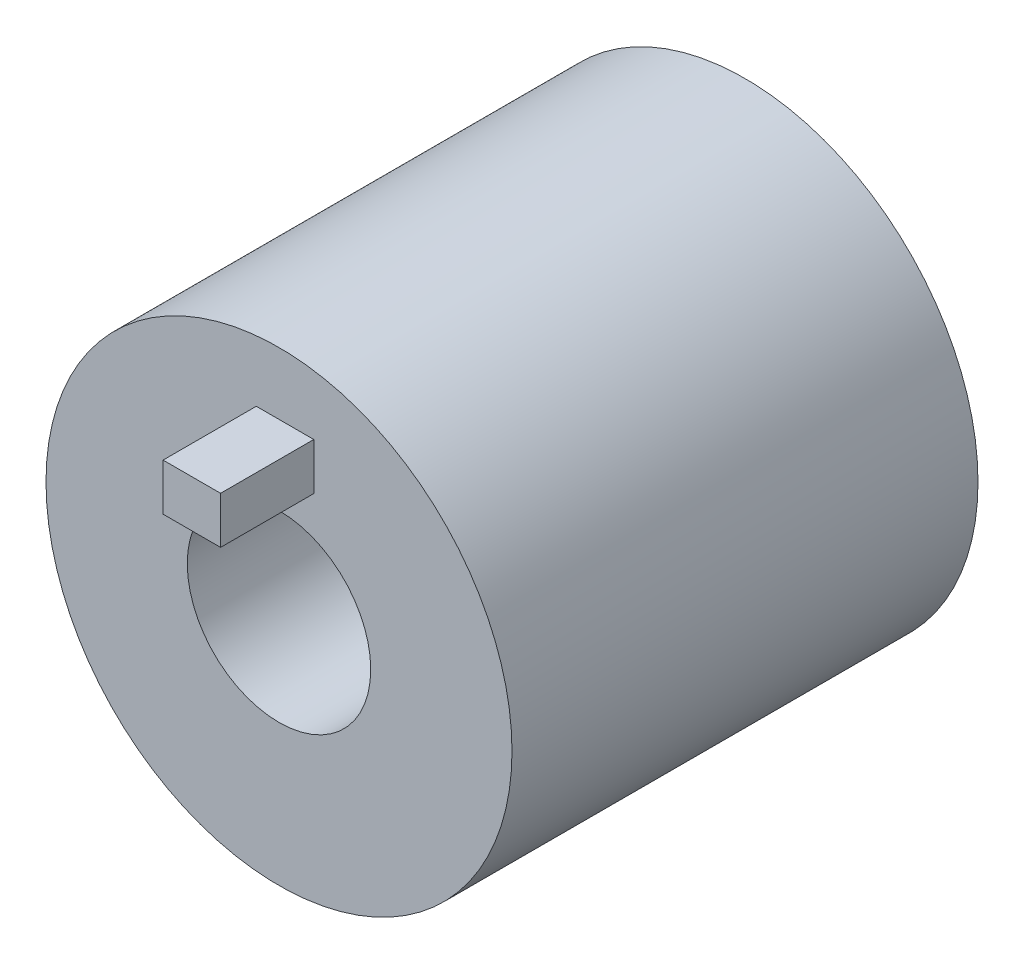
ISO-10303-21;
HEADER;
FILE_DESCRIPTION(('STEP AP214'),'2;1');
FILE_NAME('part.step','',(''),(''),'','','');
FILE_SCHEMA(('AUTOMOTIVE_DESIGN { 1 0 10303 214 1 1 1 1 }'));
ENDSEC;
DATA;
#1=APPLICATION_CONTEXT('core data for automotive mechanical design processes');
#2=APPLICATION_PROTOCOL_DEFINITION('international standard','automotive_design',2000,#1);
#3=PRODUCT_CONTEXT('',#1,'mechanical');
#4=PRODUCT('Part','Part','',(#3));
#5=PRODUCT_RELATED_PRODUCT_CATEGORY('part','',(#4));
#6=PRODUCT_DEFINITION_FORMATION('','',#4);
#7=PRODUCT_DEFINITION_CONTEXT('part definition',#1,'design');
#8=PRODUCT_DEFINITION('design','',#6,#7);
#9=PRODUCT_DEFINITION_SHAPE('','',#8);
#10=(LENGTH_UNIT() NAMED_UNIT(*) SI_UNIT(.MILLI.,.METRE.));
#11=(NAMED_UNIT(*) PLANE_ANGLE_UNIT() SI_UNIT($,.RADIAN.));
#12=(NAMED_UNIT(*) SI_UNIT($,.STERADIAN.) SOLID_ANGLE_UNIT());
#13=UNCERTAINTY_MEASURE_WITH_UNIT(LENGTH_MEASURE(1.E-05),#10,'distance_accuracy_value','');
#14=(GEOMETRIC_REPRESENTATION_CONTEXT(3) GLOBAL_UNCERTAINTY_ASSIGNED_CONTEXT((#13)) GLOBAL_UNIT_ASSIGNED_CONTEXT((#10,
#11,#12)) REPRESENTATION_CONTEXT('',''));
#15=CARTESIAN_POINT('',(0.,0.,0.));
#16=DIRECTION('',(0.,0.,1.));
#17=DIRECTION('',(1.,0.,0.));
#18=AXIS2_PLACEMENT_3D('',#15,#16,#17);
#19=CARTESIAN_POINT('',(0.,0.,12.7));
#20=DIRECTION('',(0.,0.,1.));
#21=DIRECTION('',(1.,0.,0.));
#22=AXIS2_PLACEMENT_3D('',#19,#20,#21);
#23=PLANE('',#22);
#24=CARTESIAN_POINT('',(0.,0.,12.7));
#25=DIRECTION('',(0.,0.,1.));
#26=DIRECTION('',(1.,0.,0.));
#27=AXIS2_PLACEMENT_3D('',#24,#25,#26);
#28=CIRCLE('',#27,6.35);
#29=CARTESIAN_POINT('',(6.35,0.,12.7));
#30=VERTEX_POINT('',#29);
#31=EDGE_CURVE('E11',#30,#30,#28,.T.);
#32=ORIENTED_EDGE('',*,*,#31,.T.);
#33=EDGE_LOOP('',(#32));
#34=FACE_BOUND('',#33,.T.);
#35=CARTESIAN_POINT('',(0.,0.,12.7));
#36=DIRECTION('',(0.,0.,1.));
#37=DIRECTION('',(1.,0.,0.));
#38=AXIS2_PLACEMENT_3D('',#35,#36,#37);
#39=CIRCLE('',#38,2.499995);
#40=CARTESIAN_POINT('',(2.499995,0.,12.7));
#41=VERTEX_POINT('',#40);
#42=EDGE_CURVE('E137',#41,#41,#39,.T.);
#43=ORIENTED_EDGE('',*,*,#42,.F.);
#44=EDGE_LOOP('',(#43));
#45=FACE_BOUND('',#44,.T.);
#46=DIRECTION('',(1.,0.,0.));
#47=VECTOR('',#46,1.);
#48=CARTESIAN_POINT('',(-0.61908162196643,3.37592946978573,12.7));
#49=LINE('',#48,#47);
#50=CARTESIAN_POINT('',(-0.61908162196643,3.37592946978573,12.7));
#51=VERTEX_POINT('',#50);
#52=CARTESIAN_POINT('',(0.947968733636093,3.37592946978573,12.7));
#53=VERTEX_POINT('',#52);
#54=EDGE_CURVE('E105',#51,#53,#49,.T.);
#55=ORIENTED_EDGE('',*,*,#54,.F.);
#56=DIRECTION('',(0.,-1.,0.));
#57=VECTOR('',#56,1.);
#58=CARTESIAN_POINT('',(-0.61908162196643,4.65278531509149,12.7));
#59=LINE('',#58,#57);
#60=CARTESIAN_POINT('',(-0.61908162196643,4.65278531509149,12.7));
#61=VERTEX_POINT('',#60);
#62=EDGE_CURVE('E119',#61,#51,#59,.T.);
#63=ORIENTED_EDGE('',*,*,#62,.F.);
#64=DIRECTION('',(-1.,0.,0.));
#65=VECTOR('',#64,1.);
#66=CARTESIAN_POINT('',(-0.61908162196643,4.65278531509149,12.7));
#67=LINE('',#66,#65);
#68=CARTESIAN_POINT('',(0.947968733636093,4.65278531509149,12.7));
#69=VERTEX_POINT('',#68);
#70=EDGE_CURVE('E85',#69,#61,#67,.T.);
#71=ORIENTED_EDGE('',*,*,#70,.F.);
#72=DIRECTION('',(0.,1.,0.));
#73=VECTOR('',#72,1.);
#74=CARTESIAN_POINT('',(0.947968733636093,4.65278531509149,12.7));
#75=LINE('',#74,#73);
#76=EDGE_CURVE('E125',#53,#69,#75,.T.);
#77=ORIENTED_EDGE('',*,*,#76,.F.);
#78=EDGE_LOOP('',(#55,#63,#71,#77));
#79=FACE_BOUND('',#78,.T.);
#80=ADVANCED_FACE('F47',(#34,#45,#79),#23,.T.);
#81=CARTESIAN_POINT('',(0.,0.,0.));
#82=DIRECTION('',(0.,0.,1.));
#83=DIRECTION('',(1.,0.,0.));
#84=AXIS2_PLACEMENT_3D('',#81,#82,#83);
#85=PLANE('',#84);
#86=CARTESIAN_POINT('',(0.,0.,0.));
#87=DIRECTION('',(0.,0.,1.));
#88=DIRECTION('',(1.,0.,0.));
#89=AXIS2_PLACEMENT_3D('',#86,#87,#88);
#90=CIRCLE('',#89,6.35);
#91=CARTESIAN_POINT('',(6.35,0.,0.));
#92=VERTEX_POINT('',#91);
#93=EDGE_CURVE('E51',#92,#92,#90,.T.);
#94=ORIENTED_EDGE('',*,*,#93,.F.);
#95=EDGE_LOOP('',(#94));
#96=FACE_BOUND('',#95,.T.);
#97=CARTESIAN_POINT('',(0.,0.,0.));
#98=DIRECTION('',(0.,0.,1.));
#99=DIRECTION('',(1.,0.,0.));
#100=AXIS2_PLACEMENT_3D('',#97,#98,#99);
#101=CIRCLE('',#100,2.499995);
#102=CARTESIAN_POINT('',(2.499995,0.,0.));
#103=VERTEX_POINT('',#102);
#104=EDGE_CURVE('E136',#103,#103,#101,.T.);
#105=ORIENTED_EDGE('',*,*,#104,.T.);
#106=EDGE_LOOP('',(#105));
#107=FACE_BOUND('',#106,.T.);
#108=ADVANCED_FACE('F145',(#96,#107),#85,.F.);
#109=CARTESIAN_POINT('',(0.,0.,12.7));
#110=DIRECTION('',(0.,0.,-1.));
#111=DIRECTION('',(-1.,0.,0.));
#112=AXIS2_PLACEMENT_3D('',#109,#110,#111);
#113=CYLINDRICAL_SURFACE('',#112,6.35);
#114=ORIENTED_EDGE('',*,*,#31,.F.);
#115=EDGE_LOOP('',(#114));
#116=FACE_BOUND('',#115,.T.);
#117=ORIENTED_EDGE('',*,*,#93,.T.);
#118=EDGE_LOOP('',(#117));
#119=FACE_BOUND('',#118,.T.);
#120=ADVANCED_FACE('F49',(#116,#119),#113,.T.);
#121=CARTESIAN_POINT('',(0.,0.,12.7));
#122=DIRECTION('',(0.,0.,-1.));
#123=DIRECTION('',(-1.,0.,0.));
#124=AXIS2_PLACEMENT_3D('',#121,#122,#123);
#125=CYLINDRICAL_SURFACE('',#124,2.499995);
#126=ORIENTED_EDGE('',*,*,#42,.T.);
#127=EDGE_LOOP('',(#126));
#128=FACE_BOUND('',#127,.T.);
#129=ORIENTED_EDGE('',*,*,#104,.F.);
#130=EDGE_LOOP('',(#129));
#131=FACE_BOUND('',#130,.T.);
#132=ADVANCED_FACE('F147',(#128,#131),#125,.F.);
#133=CARTESIAN_POINT('',(-0.61908162196643,4.65278531509149,15.24));
#134=DIRECTION('',(1.,0.,0.));
#135=DIRECTION('',(0.,0.,-1.));
#136=AXIS2_PLACEMENT_3D('',#133,#134,#135);
#137=PLANE('',#136);
#138=ORIENTED_EDGE('',*,*,#62,.T.);
#139=DIRECTION('',(0.,0.,-1.));
#140=VECTOR('',#139,1.);
#141=CARTESIAN_POINT('',(-0.61908162196643,3.37592946978573,15.24));
#142=LINE('',#141,#140);
#143=CARTESIAN_POINT('',(-0.61908162196643,3.37592946978573,15.24));
#144=VERTEX_POINT('',#143);
#145=EDGE_CURVE('E109',#144,#51,#142,.T.);
#146=ORIENTED_EDGE('',*,*,#145,.F.);
#147=DIRECTION('',(0.,-1.,0.));
#148=VECTOR('',#147,1.);
#149=CARTESIAN_POINT('',(-0.61908162196643,4.65278531509149,15.24));
#150=LINE('',#149,#148);
#151=CARTESIAN_POINT('',(-0.61908162196643,4.65278531509149,15.24));
#152=VERTEX_POINT('',#151);
#153=EDGE_CURVE('E97',#152,#144,#150,.T.);
#154=ORIENTED_EDGE('',*,*,#153,.F.);
#155=DIRECTION('',(0.,0.,-1.));
#156=VECTOR('',#155,1.);
#157=CARTESIAN_POINT('',(-0.61908162196643,4.65278531509149,15.24));
#158=LINE('',#157,#156);
#159=EDGE_CURVE('E115',#152,#61,#158,.T.);
#160=ORIENTED_EDGE('',*,*,#159,.T.);
#161=EDGE_LOOP('',(#138,#146,#154,#160));
#162=FACE_BOUND('',#161,.T.);
#163=ADVANCED_FACE('F149',(#162),#137,.F.);
#164=CARTESIAN_POINT('',(-0.61908162196643,3.37592946978573,15.24));
#165=DIRECTION('',(0.,1.,0.));
#166=DIRECTION('',(0.,0.,1.));
#167=AXIS2_PLACEMENT_3D('',#164,#165,#166);
#168=PLANE('',#167);
#169=ORIENTED_EDGE('',*,*,#54,.T.);
#170=DIRECTION('',(0.,0.,-1.));
#171=VECTOR('',#170,1.);
#172=CARTESIAN_POINT('',(0.947968733636093,3.37592946978573,15.24));
#173=LINE('',#172,#171);
#174=CARTESIAN_POINT('',(0.947968733636093,3.37592946978573,15.24));
#175=VERTEX_POINT('',#174);
#176=EDGE_CURVE('E102',#175,#53,#173,.T.);
#177=ORIENTED_EDGE('',*,*,#176,.F.);
#178=DIRECTION('',(1.,0.,0.));
#179=VECTOR('',#178,1.);
#180=CARTESIAN_POINT('',(-0.61908162196643,3.37592946978573,15.24));
#181=LINE('',#180,#179);
#182=EDGE_CURVE('E92',#144,#175,#181,.T.);
#183=ORIENTED_EDGE('',*,*,#182,.F.);
#184=ORIENTED_EDGE('',*,*,#145,.T.);
#185=EDGE_LOOP('',(#169,#177,#183,#184));
#186=FACE_BOUND('',#185,.T.);
#187=ADVANCED_FACE('F103',(#186),#168,.F.);
#188=CARTESIAN_POINT('',(0.947968733636093,4.65278531509149,15.24));
#189=DIRECTION('',(-1.,0.,0.));
#190=DIRECTION('',(0.,0.,1.));
#191=AXIS2_PLACEMENT_3D('',#188,#189,#190);
#192=PLANE('',#191);
#193=ORIENTED_EDGE('',*,*,#76,.T.);
#194=DIRECTION('',(0.,0.,-1.));
#195=VECTOR('',#194,1.);
#196=CARTESIAN_POINT('',(0.947968733636093,4.65278531509149,15.24));
#197=LINE('',#196,#195);
#198=CARTESIAN_POINT('',(0.947968733636093,4.65278531509149,15.24));
#199=VERTEX_POINT('',#198);
#200=EDGE_CURVE('E63',#199,#69,#197,.T.);
#201=ORIENTED_EDGE('',*,*,#200,.F.);
#202=DIRECTION('',(0.,1.,0.));
#203=VECTOR('',#202,1.);
#204=CARTESIAN_POINT('',(0.947968733636093,4.65278531509149,15.24));
#205=LINE('',#204,#203);
#206=EDGE_CURVE('E95',#175,#199,#205,.T.);
#207=ORIENTED_EDGE('',*,*,#206,.F.);
#208=ORIENTED_EDGE('',*,*,#176,.T.);
#209=EDGE_LOOP('',(#193,#201,#207,#208));
#210=FACE_BOUND('',#209,.T.);
#211=ADVANCED_FACE('F111',(#210),#192,.F.);
#212=CARTESIAN_POINT('',(-0.61908162196643,4.65278531509149,15.24));
#213=DIRECTION('',(0.,-1.,0.));
#214=DIRECTION('',(0.,0.,-1.));
#215=AXIS2_PLACEMENT_3D('',#212,#213,#214);
#216=PLANE('',#215);
#217=ORIENTED_EDGE('',*,*,#70,.T.);
#218=ORIENTED_EDGE('',*,*,#159,.F.);
#219=DIRECTION('',(-1.,0.,0.));
#220=VECTOR('',#219,1.);
#221=CARTESIAN_POINT('',(-0.61908162196643,4.65278531509149,15.24));
#222=LINE('',#221,#220);
#223=EDGE_CURVE('E71',#199,#152,#222,.T.);
#224=ORIENTED_EDGE('',*,*,#223,.F.);
#225=ORIENTED_EDGE('',*,*,#200,.T.);
#226=EDGE_LOOP('',(#217,#218,#224,#225));
#227=FACE_BOUND('',#226,.T.);
#228=ADVANCED_FACE('F171',(#227),#216,.F.);
#229=CARTESIAN_POINT('',(0.,0.,15.24));
#230=DIRECTION('',(0.,0.,1.));
#231=DIRECTION('',(1.,0.,0.));
#232=AXIS2_PLACEMENT_3D('',#229,#230,#231);
#233=PLANE('',#232);
#234=ORIENTED_EDGE('',*,*,#153,.T.);
#235=ORIENTED_EDGE('',*,*,#182,.T.);
#236=ORIENTED_EDGE('',*,*,#206,.T.);
#237=ORIENTED_EDGE('',*,*,#223,.T.);
#238=EDGE_LOOP('',(#234,#235,#236,#237));
#239=FACE_BOUND('',#238,.T.);
#240=ADVANCED_FACE('F93',(#239),#233,.T.);
#241=CLOSED_SHELL('',(#80,#108,#120,#132,#163,#187,#211,#228,#240));
#242=MANIFOLD_SOLID_BREP('B2',#241);
#243=ADVANCED_BREP_SHAPE_REPRESENTATION('',(#18,#242),#14);
#244=SHAPE_DEFINITION_REPRESENTATION(#9,#243);
ENDSEC;
END-ISO-10303-21;
